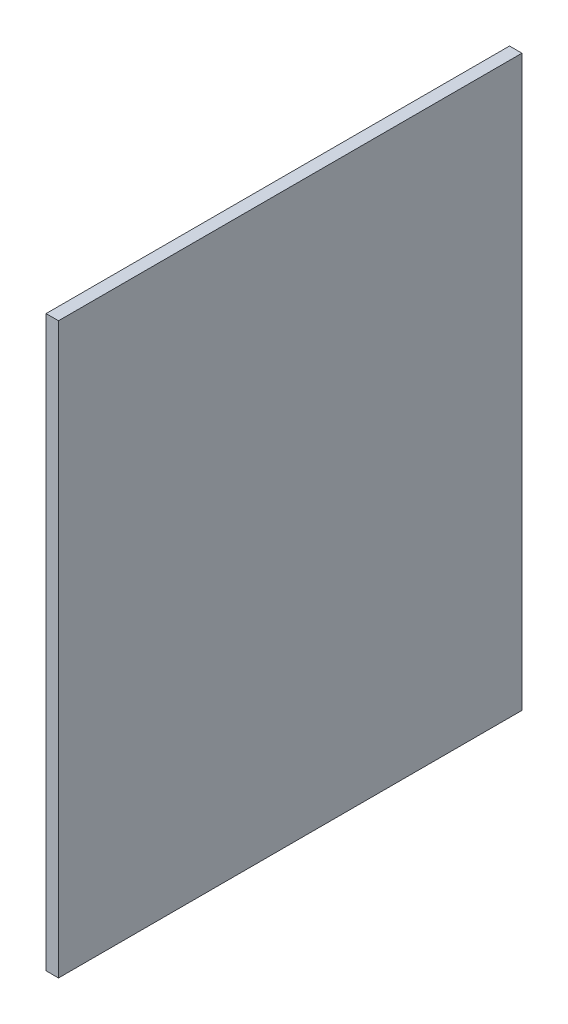
ISO-10303-21;
HEADER;
FILE_DESCRIPTION(('STEP AP214'),'2;1');
FILE_NAME('part.step','',(''),(''),'','','');
FILE_SCHEMA(('AUTOMOTIVE_DESIGN { 1 0 10303 214 1 1 1 1 }'));
ENDSEC;
DATA;
#1=APPLICATION_CONTEXT('core data for automotive mechanical design processes');
#2=APPLICATION_PROTOCOL_DEFINITION('international standard','automotive_design',2000,#1);
#3=PRODUCT_CONTEXT('',#1,'mechanical');
#4=PRODUCT('Part','Part','',(#3));
#5=PRODUCT_RELATED_PRODUCT_CATEGORY('part','',(#4));
#6=PRODUCT_DEFINITION_FORMATION('','',#4);
#7=PRODUCT_DEFINITION_CONTEXT('part definition',#1,'design');
#8=PRODUCT_DEFINITION('design','',#6,#7);
#9=PRODUCT_DEFINITION_SHAPE('','',#8);
#10=(LENGTH_UNIT() NAMED_UNIT(*) SI_UNIT(.MILLI.,.METRE.));
#11=(NAMED_UNIT(*) PLANE_ANGLE_UNIT() SI_UNIT($,.RADIAN.));
#12=(NAMED_UNIT(*) SI_UNIT($,.STERADIAN.) SOLID_ANGLE_UNIT());
#13=UNCERTAINTY_MEASURE_WITH_UNIT(LENGTH_MEASURE(1.E-05),#10,'distance_accuracy_value','');
#14=(GEOMETRIC_REPRESENTATION_CONTEXT(3) GLOBAL_UNCERTAINTY_ASSIGNED_CONTEXT((#13)) GLOBAL_UNIT_ASSIGNED_CONTEXT((#10,
#11,#12)) REPRESENTATION_CONTEXT('',''));
#15=CARTESIAN_POINT('',(0.,0.,0.));
#16=DIRECTION('',(0.,0.,1.));
#17=DIRECTION('',(1.,0.,0.));
#18=AXIS2_PLACEMENT_3D('',#15,#16,#17);
#19=CARTESIAN_POINT('',(0.,581.025,-473.075));
#20=DIRECTION('',(0.,0.,-1.));
#21=DIRECTION('',(0.,1.,0.));
#22=AXIS2_PLACEMENT_3D('',#19,#20,#21);
#23=PLANE('',#22);
#24=DIRECTION('',(0.,1.,0.));
#25=VECTOR('',#24,1.);
#26=CARTESIAN_POINT('',(25.4,581.025,-473.075));
#27=LINE('',#26,#25);
#28=CARTESIAN_POINT('',(25.4,-581.025,-473.075));
#29=VERTEX_POINT('',#28);
#30=CARTESIAN_POINT('',(25.4,581.025,-473.075));
#31=VERTEX_POINT('',#30);
#32=EDGE_CURVE('E113',#29,#31,#27,.T.);
#33=ORIENTED_EDGE('',*,*,#32,.F.);
#34=DIRECTION('',(1.,0.,0.));
#35=VECTOR('',#34,1.);
#36=CARTESIAN_POINT('',(0.,-581.025,-473.075));
#37=LINE('',#36,#35);
#38=CARTESIAN_POINT('',(0.,-581.025,-473.075));
#39=VERTEX_POINT('',#38);
#40=EDGE_CURVE('E11',#39,#29,#37,.T.);
#41=ORIENTED_EDGE('',*,*,#40,.F.);
#42=DIRECTION('',(0.,1.,0.));
#43=VECTOR('',#42,1.);
#44=CARTESIAN_POINT('',(0.,581.025,-473.075));
#45=LINE('',#44,#43);
#46=CARTESIAN_POINT('',(0.,581.025,-473.075));
#47=VERTEX_POINT('',#46);
#48=EDGE_CURVE('E107',#39,#47,#45,.T.);
#49=ORIENTED_EDGE('',*,*,#48,.T.);
#50=DIRECTION('',(1.,0.,0.));
#51=VECTOR('',#50,1.);
#52=CARTESIAN_POINT('',(0.,581.025,-473.075));
#53=LINE('',#52,#51);
#54=EDGE_CURVE('E53',#47,#31,#53,.T.);
#55=ORIENTED_EDGE('',*,*,#54,.T.);
#56=EDGE_LOOP('',(#33,#41,#49,#55));
#57=FACE_BOUND('',#56,.T.);
#58=ADVANCED_FACE('F49',(#57),#23,.T.);
#59=CARTESIAN_POINT('',(0.,-581.025,473.075));
#60=DIRECTION('',(0.,-1.,0.));
#61=DIRECTION('',(0.,0.,-1.));
#62=AXIS2_PLACEMENT_3D('',#59,#60,#61);
#63=PLANE('',#62);
#64=DIRECTION('',(0.,0.,-1.));
#65=VECTOR('',#64,1.);
#66=CARTESIAN_POINT('',(25.4,-581.025,473.075));
#67=LINE('',#66,#65);
#68=CARTESIAN_POINT('',(25.4,-581.025,473.075));
#69=VERTEX_POINT('',#68);
#70=EDGE_CURVE('E109',#69,#29,#67,.T.);
#71=ORIENTED_EDGE('',*,*,#70,.F.);
#72=DIRECTION('',(1.,0.,0.));
#73=VECTOR('',#72,1.);
#74=CARTESIAN_POINT('',(0.,-581.025,473.075));
#75=LINE('',#74,#73);
#76=CARTESIAN_POINT('',(0.,-581.025,473.075));
#77=VERTEX_POINT('',#76);
#78=EDGE_CURVE('E59',#77,#69,#75,.T.);
#79=ORIENTED_EDGE('',*,*,#78,.F.);
#80=DIRECTION('',(0.,0.,-1.));
#81=VECTOR('',#80,1.);
#82=CARTESIAN_POINT('',(0.,-581.025,473.075));
#83=LINE('',#82,#81);
#84=EDGE_CURVE('E104',#77,#39,#83,.T.);
#85=ORIENTED_EDGE('',*,*,#84,.T.);
#86=ORIENTED_EDGE('',*,*,#40,.T.);
#87=EDGE_LOOP('',(#71,#79,#85,#86));
#88=FACE_BOUND('',#87,.T.);
#89=ADVANCED_FACE('F123',(#88),#63,.T.);
#90=CARTESIAN_POINT('',(0.,581.025,473.075));
#91=DIRECTION('',(0.,0.,1.));
#92=DIRECTION('',(0.,-1.,0.));
#93=AXIS2_PLACEMENT_3D('',#90,#91,#92);
#94=PLANE('',#93);
#95=DIRECTION('',(0.,-1.,0.));
#96=VECTOR('',#95,1.);
#97=CARTESIAN_POINT('',(25.4,581.025,473.075));
#98=LINE('',#97,#96);
#99=CARTESIAN_POINT('',(25.4,581.025,473.075));
#100=VERTEX_POINT('',#99);
#101=EDGE_CURVE('E100',#100,#69,#98,.T.);
#102=ORIENTED_EDGE('',*,*,#101,.F.);
#103=DIRECTION('',(1.,0.,0.));
#104=VECTOR('',#103,1.);
#105=CARTESIAN_POINT('',(0.,581.025,473.075));
#106=LINE('',#105,#104);
#107=CARTESIAN_POINT('',(0.,581.025,473.075));
#108=VERTEX_POINT('',#107);
#109=EDGE_CURVE('E95',#108,#100,#106,.T.);
#110=ORIENTED_EDGE('',*,*,#109,.F.);
#111=DIRECTION('',(0.,-1.,0.));
#112=VECTOR('',#111,1.);
#113=CARTESIAN_POINT('',(0.,581.025,473.075));
#114=LINE('',#113,#112);
#115=EDGE_CURVE('E98',#108,#77,#114,.T.);
#116=ORIENTED_EDGE('',*,*,#115,.T.);
#117=ORIENTED_EDGE('',*,*,#78,.T.);
#118=EDGE_LOOP('',(#102,#110,#116,#117));
#119=FACE_BOUND('',#118,.T.);
#120=ADVANCED_FACE('F97',(#119),#94,.T.);
#121=CARTESIAN_POINT('',(0.,581.025,473.075));
#122=DIRECTION('',(0.,1.,0.));
#123=DIRECTION('',(0.,0.,1.));
#124=AXIS2_PLACEMENT_3D('',#121,#122,#123);
#125=PLANE('',#124);
#126=DIRECTION('',(0.,0.,1.));
#127=VECTOR('',#126,1.);
#128=CARTESIAN_POINT('',(25.4,581.025,473.075));
#129=LINE('',#128,#127);
#130=EDGE_CURVE('E116',#31,#100,#129,.T.);
#131=ORIENTED_EDGE('',*,*,#130,.F.);
#132=ORIENTED_EDGE('',*,*,#54,.F.);
#133=DIRECTION('',(0.,0.,1.));
#134=VECTOR('',#133,1.);
#135=CARTESIAN_POINT('',(0.,581.025,473.075));
#136=LINE('',#135,#134);
#137=EDGE_CURVE('E103',#47,#108,#136,.T.);
#138=ORIENTED_EDGE('',*,*,#137,.T.);
#139=ORIENTED_EDGE('',*,*,#109,.T.);
#140=EDGE_LOOP('',(#131,#132,#138,#139));
#141=FACE_BOUND('',#140,.T.);
#142=ADVANCED_FACE('F106',(#141),#125,.T.);
#143=CARTESIAN_POINT('',(25.4,0.,0.));
#144=DIRECTION('',(1.,0.,0.));
#145=DIRECTION('',(0.,0.,-1.));
#146=AXIS2_PLACEMENT_3D('',#143,#144,#145);
#147=PLANE('',#146);
#148=ORIENTED_EDGE('',*,*,#32,.T.);
#149=ORIENTED_EDGE('',*,*,#130,.T.);
#150=ORIENTED_EDGE('',*,*,#101,.T.);
#151=ORIENTED_EDGE('',*,*,#70,.T.);
#152=EDGE_LOOP('',(#148,#149,#150,#151));
#153=FACE_BOUND('',#152,.T.);
#154=ADVANCED_FACE('F122',(#153),#147,.T.);
#155=CARTESIAN_POINT('',(0.,0.,0.));
#156=DIRECTION('',(1.,0.,0.));
#157=DIRECTION('',(0.,0.,-1.));
#158=AXIS2_PLACEMENT_3D('',#155,#156,#157);
#159=PLANE('',#158);
#160=ORIENTED_EDGE('',*,*,#48,.F.);
#161=ORIENTED_EDGE('',*,*,#84,.F.);
#162=ORIENTED_EDGE('',*,*,#115,.F.);
#163=ORIENTED_EDGE('',*,*,#137,.F.);
#164=EDGE_LOOP('',(#160,#161,#162,#163));
#165=FACE_BOUND('',#164,.T.);
#166=ADVANCED_FACE('F51',(#165),#159,.F.);
#167=CLOSED_SHELL('',(#58,#89,#120,#142,#154,#166));
#168=MANIFOLD_SOLID_BREP('B2',#167);
#169=ADVANCED_BREP_SHAPE_REPRESENTATION('',(#18,#168),#14);
#170=SHAPE_DEFINITION_REPRESENTATION(#9,#169);
ENDSEC;
END-ISO-10303-21;
